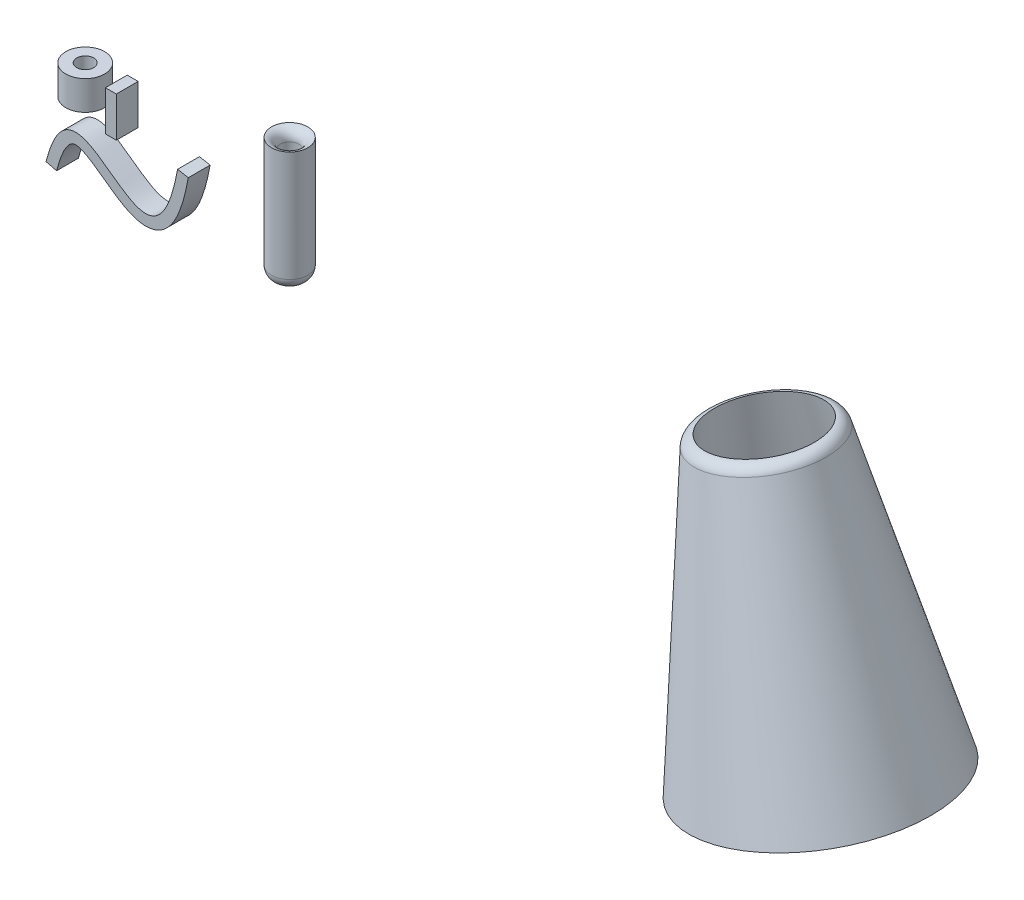
ISO-10303-21;
HEADER;
FILE_DESCRIPTION(('STEP AP214'),'2;1');
FILE_NAME('part.step','',(''),(''),'','','');
FILE_SCHEMA(('AUTOMOTIVE_DESIGN { 1 0 10303 214 1 1 1 1 }'));
ENDSEC;
DATA;
#1=APPLICATION_CONTEXT('core data for automotive mechanical design processes');
#2=APPLICATION_PROTOCOL_DEFINITION('international standard','automotive_design',2000,#1);
#3=PRODUCT_CONTEXT('',#1,'mechanical');
#4=PRODUCT('Part','Part','',(#3));
#5=PRODUCT_RELATED_PRODUCT_CATEGORY('part','',(#4));
#6=PRODUCT_DEFINITION_FORMATION('','',#4);
#7=PRODUCT_DEFINITION_CONTEXT('part definition',#1,'design');
#8=PRODUCT_DEFINITION('design','',#6,#7);
#9=PRODUCT_DEFINITION_SHAPE('','',#8);
#10=(LENGTH_UNIT() NAMED_UNIT(*) SI_UNIT(.MILLI.,.METRE.));
#11=(NAMED_UNIT(*) PLANE_ANGLE_UNIT() SI_UNIT($,.RADIAN.));
#12=(NAMED_UNIT(*) SI_UNIT($,.STERADIAN.) SOLID_ANGLE_UNIT());
#13=UNCERTAINTY_MEASURE_WITH_UNIT(LENGTH_MEASURE(1.E-05),#10,'distance_accuracy_value','');
#14=(GEOMETRIC_REPRESENTATION_CONTEXT(3) GLOBAL_UNCERTAINTY_ASSIGNED_CONTEXT((#13)) GLOBAL_UNIT_ASSIGNED_CONTEXT((#10,
#11,#12)) REPRESENTATION_CONTEXT('',''));
#15=CARTESIAN_POINT('',(0.,0.,0.));
#16=DIRECTION('',(0.,0.,1.));
#17=DIRECTION('',(1.,0.,0.));
#18=AXIS2_PLACEMENT_3D('',#15,#16,#17);
#19=CARTESIAN_POINT('',(638.372372972977,101.336227051081,0.));
#20=DIRECTION('',(0.198782437077878,-0.980043643267676,0.));
#21=DIRECTION('',(0.980043643267676,0.198782437077878,0.));
#22=AXIS2_PLACEMENT_3D('',#19,#20,#21);
#23=CONICAL_SURFACE('',#22,54.543291757021,0.184207659163879);
#24=CARTESIAN_POINT('',(640.287083984222,91.8962564840138,0.));
#25=DIRECTION('',(0.198782437077878,-0.980043643267676,0.));
#26=DIRECTION('',(0.980043643267676,0.198782437077878,0.));
#27=AXIS2_PLACEMENT_3D('',#24,#25,#26);
#28=CIRCLE('',#27,56.3379609288582);
#29=CARTESIAN_POINT('',(695.500744467212,103.095253657451,0.));
#30=VERTEX_POINT('',#29);
#31=EDGE_CURVE('E89',#30,#30,#28,.T.);
#32=ORIENTED_EDGE('',*,*,#31,.T.);
#33=EDGE_LOOP('',(#32));
#34=FACE_BOUND('',#33,.T.);
#35=CARTESIAN_POINT('',(690.219048969403,-154.279942977813,0.));
#36=DIRECTION('',(-0.198782437077878,0.980043643267676,0.));
#37=DIRECTION('',(-0.980043643267676,-0.198782437077878,0.));
#38=AXIS2_PLACEMENT_3D('',#35,#36,#37);
#39=CIRCLE('',#38,103.139466598326);
#40=CARTESIAN_POINT('',(589.137870359695,-174.782257507141,0.));
#41=VERTEX_POINT('',#40);
#42=EDGE_CURVE('E94',#41,#41,#39,.T.);
#43=ORIENTED_EDGE('',*,*,#42,.T.);
#44=EDGE_LOOP('',(#43));
#45=FACE_BOUND('',#44,.T.);
#46=ADVANCED_FACE('F78',(#34,#45),#23,.T.);
#47=CARTESIAN_POINT('',(638.663657076352,99.9001286809533,0.));
#48=DIRECTION('',(0.198782437077878,-0.980043643267676,0.));
#49=DIRECTION('',(0.980043643267676,0.198782437077878,0.));
#50=AXIS2_PLACEMENT_3D('',#47,#48,#49);
#51=CONICAL_SURFACE('',#50,46.6786382336649,0.184207659163879);
#52=CARTESIAN_POINT('',(688.595622061533,-146.276070780872,0.));
#53=DIRECTION('',(-0.198782437077878,0.980043643267676,0.));
#54=DIRECTION('',(-0.980043643267676,-0.198782437077878,0.));
#55=AXIS2_PLACEMENT_3D('',#52,#53,#54);
#56=CIRCLE('',#55,93.4801439031325);
#57=CARTESIAN_POINT('',(596.98100125752,-164.858281604327,0.));
#58=VERTEX_POINT('',#57);
#59=EDGE_CURVE('E12',#58,#58,#56,.F.);
#60=ORIENTED_EDGE('',*,*,#59,.T.);
#61=EDGE_LOOP('',(#60));
#62=FACE_BOUND('',#61,.T.);
#63=CARTESIAN_POINT('',(638.663657076352,99.9001286809533,0.));
#64=DIRECTION('',(-0.198782437077878,0.980043643267676,0.));
#65=DIRECTION('',(-0.980043643267676,-0.198782437077878,0.));
#66=AXIS2_PLACEMENT_3D('',#63,#64,#65);
#67=CIRCLE('',#66,46.6786382336648);
#68=CARTESIAN_POINT('',(592.916554399057,90.6212352133888,0.));
#69=VERTEX_POINT('',#68);
#70=EDGE_CURVE('E91',#69,#69,#67,.T.);
#71=ORIENTED_EDGE('',*,*,#70,.T.);
#72=EDGE_LOOP('',(#71));
#73=FACE_BOUND('',#72,.T.);
#74=ADVANCED_FACE('F107',(#62,#73),#51,.F.);
#75=CARTESIAN_POINT('',(640.65118911344,90.1011335213545,0.));
#76=DIRECTION('',(-0.198782437077878,0.980043643267676,0.));
#77=DIRECTION('',(-0.980043643267676,-0.198782437077878,0.));
#78=AXIS2_PLACEMENT_3D('',#75,#76,#77);
#79=TOROIDAL_SURFACE('',#78,46.507144024663,10.);
#80=ORIENTED_EDGE('',*,*,#31,.F.);
#81=EDGE_LOOP('',(#80));
#82=FACE_BOUND('',#81,.T.);
#83=ORIENTED_EDGE('',*,*,#70,.F.);
#84=EDGE_LOOP('',(#83));
#85=FACE_BOUND('',#84,.T.);
#86=ADVANCED_FACE('F101',(#82,#85),#79,.T.);
#87=CARTESIAN_POINT('',(688.231516932315,-144.480947818213,0.));
#88=DIRECTION('',(0.198782437077878,-0.980043643267676,0.));
#89=DIRECTION('',(0.980043643267676,0.198782437077878,0.));
#90=AXIS2_PLACEMENT_3D('',#87,#88,#89);
#91=TOROIDAL_SURFACE('',#90,103.310960807328,10.);
#92=ORIENTED_EDGE('',*,*,#59,.F.);
#93=EDGE_LOOP('',(#92));
#94=FACE_BOUND('',#93,.T.);
#95=ORIENTED_EDGE('',*,*,#42,.F.);
#96=EDGE_LOOP('',(#95));
#97=FACE_BOUND('',#96,.T.);
#98=ADVANCED_FACE('F85',(#94,#97),#91,.T.);
#99=CLOSED_SHELL('',(#46,#74,#86,#98));
#100=MANIFOLD_SOLID_BREP('B2',#99);
#101=CARTESIAN_POINT('',(203.452118624857,111.046344000849,0.));
#102=DIRECTION('',(0.,1.,0.));
#103=DIRECTION('',(0.,0.,1.));
#104=AXIS2_PLACEMENT_3D('',#101,#102,#103);
#105=CYLINDRICAL_SURFACE('',#104,16.6116934547917);
#106=CARTESIAN_POINT('',(203.452118624857,9.79795897113271,0.));
#107=DIRECTION('',(0.,-1.,0.));
#108=DIRECTION('',(0.,0.,-1.));
#109=AXIS2_PLACEMENT_3D('',#106,#107,#108);
#110=CIRCLE('',#109,16.6116934547917);
#111=CARTESIAN_POINT('',(203.452118624857,9.79795897113271,-16.6116934547917));
#112=VERTEX_POINT('',#111);
#113=EDGE_CURVE('E79',#112,#112,#110,.F.);
#114=ORIENTED_EDGE('',*,*,#113,.T.);
#115=EDGE_LOOP('',(#114));
#116=FACE_BOUND('',#115,.T.);
#117=CARTESIAN_POINT('',(203.452118624857,111.046344000849,0.));
#118=DIRECTION('',(0.,1.,0.));
#119=DIRECTION('',(0.,0.,1.));
#120=AXIS2_PLACEMENT_3D('',#117,#118,#119);
#121=CIRCLE('',#120,16.6116934547917);
#122=CARTESIAN_POINT('',(203.452118624857,111.046344000849,16.6116934547917));
#123=VERTEX_POINT('',#122);
#124=EDGE_CURVE('E164',#123,#123,#121,.T.);
#125=ORIENTED_EDGE('',*,*,#124,.F.);
#126=EDGE_LOOP('',(#125));
#127=FACE_BOUND('',#126,.T.);
#128=ADVANCED_FACE('F148',(#116,#127),#105,.T.);
#129=CARTESIAN_POINT('',(203.452118624857,111.046344000849,0.));
#130=DIRECTION('',(0.,1.,0.));
#131=DIRECTION('',(0.,0.,1.));
#132=AXIS2_PLACEMENT_3D('',#129,#130,#131);
#133=CYLINDRICAL_SURFACE('',#132,8.61169345479168);
#134=CARTESIAN_POINT('',(203.452118624857,101.248385029717,0.));
#135=DIRECTION('',(0.,1.,0.));
#136=DIRECTION('',(0.,0.,1.));
#137=AXIS2_PLACEMENT_3D('',#134,#135,#136);
#138=CIRCLE('',#137,8.61169345479168);
#139=CARTESIAN_POINT('',(203.452118624857,101.248385029717,8.61169345479168));
#140=VERTEX_POINT('',#139);
#141=EDGE_CURVE('E160',#140,#140,#138,.T.);
#142=ORIENTED_EDGE('',*,*,#141,.T.);
#143=EDGE_LOOP('',(#142));
#144=FACE_BOUND('',#143,.T.);
#145=CARTESIAN_POINT('',(203.452118624857,0.,0.));
#146=DIRECTION('',(0.,1.,0.));
#147=DIRECTION('',(0.,0.,1.));
#148=AXIS2_PLACEMENT_3D('',#145,#146,#147);
#149=CIRCLE('',#148,8.61169345479168);
#150=CARTESIAN_POINT('',(203.452118624857,0.,8.61169345479168));
#151=VERTEX_POINT('',#150);
#152=EDGE_CURVE('E163',#151,#151,#149,.T.);
#153=ORIENTED_EDGE('',*,*,#152,.F.);
#154=EDGE_LOOP('',(#153));
#155=FACE_BOUND('',#154,.T.);
#156=ADVANCED_FACE('F174',(#144,#155),#133,.F.);
#157=CARTESIAN_POINT('',(203.452118624857,101.248385029717,0.));
#158=DIRECTION('',(0.,1.,0.));
#159=DIRECTION('',(0.,0.,1.));
#160=AXIS2_PLACEMENT_3D('',#157,#158,#159);
#161=TOROIDAL_SURFACE('',#160,18.6116934547917,10.);
#162=ORIENTED_EDGE('',*,*,#124,.T.);
#163=EDGE_LOOP('',(#162));
#164=FACE_BOUND('',#163,.T.);
#165=ORIENTED_EDGE('',*,*,#141,.F.);
#166=EDGE_LOOP('',(#165));
#167=FACE_BOUND('',#166,.T.);
#168=ADVANCED_FACE('F171',(#164,#167),#161,.T.);
#169=CARTESIAN_POINT('',(203.452118624857,9.79795897113271,0.));
#170=DIRECTION('',(0.,-1.,0.));
#171=DIRECTION('',(0.,0.,-1.));
#172=AXIS2_PLACEMENT_3D('',#169,#170,#171);
#173=DEGENERATE_TOROIDAL_SURFACE('',#172,6.61169345479169,10.,.T.);
#174=ORIENTED_EDGE('',*,*,#152,.T.);
#175=EDGE_LOOP('',(#174));
#176=FACE_BOUND('',#175,.T.);
#177=ORIENTED_EDGE('',*,*,#113,.F.);
#178=EDGE_LOOP('',(#177));
#179=FACE_BOUND('',#178,.T.);
#180=ADVANCED_FACE('F154',(#176,#179),#173,.T.);
#181=CLOSED_SHELL('',(#128,#156,#168,#180));
#182=MANIFOLD_SOLID_BREP('B7',#181);
#183=CARTESIAN_POINT('',(15.9614921578128,76.4416820248492,0.));
#184=DIRECTION('',(0.,1.,0.));
#185=DIRECTION('',(0.,0.,1.));
#186=AXIS2_PLACEMENT_3D('',#183,#184,#185);
#187=CYLINDRICAL_SURFACE('',#186,17.7908818906369);
#188=CARTESIAN_POINT('',(15.9614921578128,49.6230693628492,0.));
#189=DIRECTION('',(0.,1.,0.));
#190=DIRECTION('',(0.,0.,1.));
#191=AXIS2_PLACEMENT_3D('',#188,#189,#190);
#192=CIRCLE('',#191,17.7908818906369);
#193=CARTESIAN_POINT('',(15.9614921578128,49.6230693628492,17.7908818906369));
#194=VERTEX_POINT('',#193);
#195=EDGE_CURVE('E146',#194,#194,#192,.T.);
#196=ORIENTED_EDGE('',*,*,#195,.T.);
#197=EDGE_LOOP('',(#196));
#198=FACE_BOUND('',#197,.T.);
#199=CARTESIAN_POINT('',(15.9614921578128,76.4416820248492,0.));
#200=DIRECTION('',(0.,1.,0.));
#201=DIRECTION('',(0.,0.,1.));
#202=AXIS2_PLACEMENT_3D('',#199,#200,#201);
#203=CIRCLE('',#202,17.7908818906369);
#204=CARTESIAN_POINT('',(15.9614921578128,76.4416820248492,17.7908818906369));
#205=VERTEX_POINT('',#204);
#206=EDGE_CURVE('E236',#205,#205,#203,.T.);
#207=ORIENTED_EDGE('',*,*,#206,.F.);
#208=EDGE_LOOP('',(#207));
#209=FACE_BOUND('',#208,.T.);
#210=ADVANCED_FACE('F225',(#198,#209),#187,.T.);
#211=CARTESIAN_POINT('',(8.17061026717587,49.6230693628492,0.));
#212=DIRECTION('',(0.,1.,0.));
#213=DIRECTION('',(0.,0.,1.));
#214=AXIS2_PLACEMENT_3D('',#211,#212,#213);
#215=PLANE('',#214);
#216=ORIENTED_EDGE('',*,*,#195,.F.);
#217=EDGE_LOOP('',(#216));
#218=FACE_BOUND('',#217,.T.);
#219=CARTESIAN_POINT('',(15.9614921578128,49.6230693628492,0.));
#220=DIRECTION('',(0.,1.,0.));
#221=DIRECTION('',(0.,0.,1.));
#222=AXIS2_PLACEMENT_3D('',#219,#220,#221);
#223=CIRCLE('',#222,7.79088189063688);
#224=CARTESIAN_POINT('',(15.9614921578128,49.6230693628492,7.79088189063688));
#225=VERTEX_POINT('',#224);
#226=EDGE_CURVE('E226',#225,#225,#223,.T.);
#227=ORIENTED_EDGE('',*,*,#226,.T.);
#228=EDGE_LOOP('',(#227));
#229=FACE_BOUND('',#228,.T.);
#230=ADVANCED_FACE('F244',(#218,#229),#215,.F.);
#231=CARTESIAN_POINT('',(15.9614921578128,76.4416820248492,0.));
#232=DIRECTION('',(0.,1.,0.));
#233=DIRECTION('',(0.,0.,1.));
#234=AXIS2_PLACEMENT_3D('',#231,#232,#233);
#235=CYLINDRICAL_SURFACE('',#234,7.79088189063688);
#236=ORIENTED_EDGE('',*,*,#226,.F.);
#237=EDGE_LOOP('',(#236));
#238=FACE_BOUND('',#237,.T.);
#239=CARTESIAN_POINT('',(15.9614921578128,76.4416820248492,0.));
#240=DIRECTION('',(0.,1.,0.));
#241=DIRECTION('',(0.,0.,1.));
#242=AXIS2_PLACEMENT_3D('',#239,#240,#241);
#243=CIRCLE('',#242,7.79088189063688);
#244=CARTESIAN_POINT('',(15.9614921578128,76.4416820248492,7.79088189063688));
#245=VERTEX_POINT('',#244);
#246=EDGE_CURVE('E235',#245,#245,#243,.T.);
#247=ORIENTED_EDGE('',*,*,#246,.T.);
#248=EDGE_LOOP('',(#247));
#249=FACE_BOUND('',#248,.T.);
#250=ADVANCED_FACE('F248',(#238,#249),#235,.F.);
#251=CARTESIAN_POINT('',(-1.82938973282413,76.4416820248492,0.));
#252=DIRECTION('',(0.,-1.,0.));
#253=DIRECTION('',(0.,0.,-1.));
#254=AXIS2_PLACEMENT_3D('',#251,#252,#253);
#255=PLANE('',#254);
#256=ORIENTED_EDGE('',*,*,#246,.F.);
#257=EDGE_LOOP('',(#256));
#258=FACE_BOUND('',#257,.T.);
#259=ORIENTED_EDGE('',*,*,#206,.T.);
#260=EDGE_LOOP('',(#259));
#261=FACE_BOUND('',#260,.T.);
#262=ADVANCED_FACE('F245',(#258,#261),#255,.F.);
#263=CLOSED_SHELL('',(#210,#230,#250,#262));
#264=MANIFOLD_SOLID_BREP('B72',#263);
#265=CARTESIAN_POINT('',(54.4899386332439,85.934780446792,20.));
#266=DIRECTION('',(1.,0.,0.));
#267=DIRECTION('',(0.,0.,-1.));
#268=AXIS2_PLACEMENT_3D('',#265,#266,#267);
#269=PLANE('',#268);
#270=DIRECTION('',(0.,1.,0.));
#271=VECTOR('',#270,1.);
#272=CARTESIAN_POINT('',(54.4899386332439,85.934780446792,0.));
#273=LINE('',#272,#271);
#274=CARTESIAN_POINT('',(54.4899386332439,85.934780446792,0.));
#275=VERTEX_POINT('',#274);
#276=CARTESIAN_POINT('',(54.4899386332439,49.2246455853272,0.));
#277=VERTEX_POINT('',#276);
#278=EDGE_CURVE('E358',#275,#277,#273,.F.);
#279=ORIENTED_EDGE('',*,*,#278,.T.);
#280=DIRECTION('',(0.,0.,-1.));
#281=VECTOR('',#280,1.);
#282=CARTESIAN_POINT('',(54.4899386332439,49.2246455853272,20.));
#283=LINE('',#282,#281);
#284=CARTESIAN_POINT('',(54.4899386332439,49.2246455853272,20.));
#285=VERTEX_POINT('',#284);
#286=EDGE_CURVE('E218',#285,#277,#283,.T.);
#287=ORIENTED_EDGE('',*,*,#286,.F.);
#288=DIRECTION('',(0.,1.,0.));
#289=VECTOR('',#288,1.);
#290=CARTESIAN_POINT('',(54.4899386332439,85.934780446792,20.));
#291=LINE('',#290,#289);
#292=CARTESIAN_POINT('',(54.4899386332439,85.934780446792,20.));
#293=VERTEX_POINT('',#292);
#294=EDGE_CURVE('E333',#293,#285,#291,.F.);
#295=ORIENTED_EDGE('',*,*,#294,.F.);
#296=DIRECTION('',(0.,0.,-1.));
#297=VECTOR('',#296,1.);
#298=CARTESIAN_POINT('',(54.4899386332439,85.934780446792,20.));
#299=LINE('',#298,#297);
#300=EDGE_CURVE('E307',#293,#275,#299,.T.);
#301=ORIENTED_EDGE('',*,*,#300,.T.);
#302=EDGE_LOOP('',(#279,#287,#295,#301));
#303=FACE_BOUND('',#302,.T.);
#304=ADVANCED_FACE('F291',(#303),#269,.F.);
#305=CARTESIAN_POINT('',(64.4899386332439,49.2246455853272,20.));
#306=DIRECTION('',(0.,-1.,0.));
#307=DIRECTION('',(0.,0.,-1.));
#308=AXIS2_PLACEMENT_3D('',#305,#306,#307);
#309=PLANE('',#308);
#310=DIRECTION('',(-1.,0.,0.));
#311=VECTOR('',#310,1.);
#312=CARTESIAN_POINT('',(64.4899386332439,49.2246455853272,0.));
#313=LINE('',#312,#311);
#314=CARTESIAN_POINT('',(64.4899386332439,49.2246455853272,0.));
#315=VERTEX_POINT('',#314);
#316=EDGE_CURVE('E345',#315,#277,#313,.T.);
#317=ORIENTED_EDGE('',*,*,#316,.F.);
#318=DIRECTION('',(0.,0.,-1.));
#319=VECTOR('',#318,1.);
#320=CARTESIAN_POINT('',(64.4899386332439,49.2246455853272,20.));
#321=LINE('',#320,#319);
#322=CARTESIAN_POINT('',(64.4899386332439,49.2246455853272,20.));
#323=VERTEX_POINT('',#322);
#324=EDGE_CURVE('E301',#323,#315,#321,.T.);
#325=ORIENTED_EDGE('',*,*,#324,.F.);
#326=DIRECTION('',(-1.,0.,0.));
#327=VECTOR('',#326,1.);
#328=CARTESIAN_POINT('',(64.4899386332439,49.2246455853272,20.));
#329=LINE('',#328,#327);
#330=EDGE_CURVE('E338',#323,#285,#329,.T.);
#331=ORIENTED_EDGE('',*,*,#330,.T.);
#332=ORIENTED_EDGE('',*,*,#286,.T.);
#333=EDGE_LOOP('',(#317,#325,#331,#332));
#334=FACE_BOUND('',#333,.T.);
#335=ADVANCED_FACE('F339',(#334),#309,.T.);
#336=CARTESIAN_POINT('',(64.4899386332439,85.934780446792,20.));
#337=DIRECTION('',(1.,0.,0.));
#338=DIRECTION('',(0.,0.,-1.));
#339=AXIS2_PLACEMENT_3D('',#336,#337,#338);
#340=PLANE('',#339);
#341=DIRECTION('',(0.,-1.,0.));
#342=VECTOR('',#341,1.);
#343=CARTESIAN_POINT('',(64.4899386332439,85.934780446792,0.));
#344=LINE('',#343,#342);
#345=CARTESIAN_POINT('',(64.4899386332439,85.934780446792,0.));
#346=VERTEX_POINT('',#345);
#347=EDGE_CURVE('E360',#346,#315,#344,.T.);
#348=ORIENTED_EDGE('',*,*,#347,.F.);
#349=DIRECTION('',(0.,0.,-1.));
#350=VECTOR('',#349,1.);
#351=CARTESIAN_POINT('',(64.4899386332439,85.934780446792,20.));
#352=LINE('',#351,#350);
#353=CARTESIAN_POINT('',(64.4899386332439,85.934780446792,20.));
#354=VERTEX_POINT('',#353);
#355=EDGE_CURVE('E325',#354,#346,#352,.T.);
#356=ORIENTED_EDGE('',*,*,#355,.F.);
#357=DIRECTION('',(0.,-1.,0.));
#358=VECTOR('',#357,1.);
#359=CARTESIAN_POINT('',(64.4899386332439,85.934780446792,20.));
#360=LINE('',#359,#358);
#361=EDGE_CURVE('E350',#354,#323,#360,.T.);
#362=ORIENTED_EDGE('',*,*,#361,.T.);
#363=ORIENTED_EDGE('',*,*,#324,.T.);
#364=EDGE_LOOP('',(#348,#356,#362,#363));
#365=FACE_BOUND('',#364,.T.);
#366=ADVANCED_FACE('F348',(#365),#340,.T.);
#367=CARTESIAN_POINT('',(54.4899386332439,85.934780446792,20.));
#368=DIRECTION('',(0.,1.,0.));
#369=DIRECTION('',(0.,0.,1.));
#370=AXIS2_PLACEMENT_3D('',#367,#368,#369);
#371=PLANE('',#370);
#372=DIRECTION('',(1.,0.,0.));
#373=VECTOR('',#372,1.);
#374=CARTESIAN_POINT('',(54.4899386332439,85.934780446792,0.));
#375=LINE('',#374,#373);
#376=EDGE_CURVE('E363',#275,#346,#375,.T.);
#377=ORIENTED_EDGE('',*,*,#376,.F.);
#378=ORIENTED_EDGE('',*,*,#300,.F.);
#379=DIRECTION('',(1.,0.,0.));
#380=VECTOR('',#379,1.);
#381=CARTESIAN_POINT('',(54.4899386332439,85.934780446792,20.));
#382=LINE('',#381,#380);
#383=EDGE_CURVE('E351',#293,#354,#382,.T.);
#384=ORIENTED_EDGE('',*,*,#383,.T.);
#385=ORIENTED_EDGE('',*,*,#355,.T.);
#386=EDGE_LOOP('',(#377,#378,#384,#385));
#387=FACE_BOUND('',#386,.T.);
#388=ADVANCED_FACE('F370',(#387),#371,.T.);
#389=CARTESIAN_POINT('',(0.,0.,20.));
#390=DIRECTION('',(0.,0.,1.));
#391=DIRECTION('',(1.,0.,0.));
#392=AXIS2_PLACEMENT_3D('',#389,#390,#391);
#393=PLANE('',#392);
#394=ORIENTED_EDGE('',*,*,#294,.T.);
#395=ORIENTED_EDGE('',*,*,#330,.F.);
#396=ORIENTED_EDGE('',*,*,#361,.F.);
#397=ORIENTED_EDGE('',*,*,#383,.F.);
#398=EDGE_LOOP('',(#394,#395,#396,#397));
#399=FACE_BOUND('',#398,.T.);
#400=ADVANCED_FACE('F349',(#399),#393,.T.);
#401=CARTESIAN_POINT('',(0.,0.,0.));
#402=DIRECTION('',(0.,0.,1.));
#403=DIRECTION('',(1.,0.,0.));
#404=AXIS2_PLACEMENT_3D('',#401,#402,#403);
#405=PLANE('',#404);
#406=ORIENTED_EDGE('',*,*,#278,.F.);
#407=ORIENTED_EDGE('',*,*,#376,.T.);
#408=ORIENTED_EDGE('',*,*,#347,.T.);
#409=ORIENTED_EDGE('',*,*,#316,.T.);
#410=EDGE_LOOP('',(#406,#407,#408,#409));
#411=FACE_BOUND('',#410,.T.);
#412=ADVANCED_FACE('F366',(#411),#405,.F.);
#413=CLOSED_SHELL('',(#304,#335,#366,#388,#400,#412));
#414=MANIFOLD_SOLID_BREP('B144',#413);
#415=CARTESIAN_POINT('',(9.69490923590925,-2.4512720998456,20.));
#416=CARTESIAN_POINT('',(10.5311688474778,0.856178359172851,20.));
#417=CARTESIAN_POINT('',(11.394386774256,3.84419741254524,20.));
#418=CARTESIAN_POINT('',(13.1533592305206,9.20694051284605,20.));
#419=CARTESIAN_POINT('',(14.0492896362296,11.5815145840632,20.));
#420=CARTESIAN_POINT('',(15.8413121087331,15.742658734528,20.));
#421=CARTESIAN_POINT('',(16.737517517862,17.5287647227855,20.));
#422=CARTESIAN_POINT('',(18.4814345025707,20.5463967391919,20.));
#423=CARTESIAN_POINT('',(19.3286793802721,21.7769702062188,20.));
#424=CARTESIAN_POINT('',(20.9123918030556,23.7460025130972,20.));
#425=CARTESIAN_POINT('',(21.6468668792936,24.4838050755776,20.));
#426=CARTESIAN_POINT('',(22.9626621572418,25.5880403665081,20.));
#427=CARTESIAN_POINT('',(23.5417164826069,25.9567946857274,20.));
#428=CARTESIAN_POINT('',(24.5982667995349,26.4876499635343,20.));
#429=CARTESIAN_POINT('',(25.0784708138462,26.6536744426382,20.));
#430=CARTESIAN_POINT('',(26.0947773614352,26.8786677388824,20.));
#431=CARTESIAN_POINT('',(26.6354672734258,26.9362581428574,20.));
#432=CARTESIAN_POINT('',(27.9016220528546,26.9202105728274,20.));
#433=CARTESIAN_POINT('',(28.6267698076733,26.8433228296364,20.));
#434=CARTESIAN_POINT('',(30.2827198681421,26.501626749094,20.));
#435=CARTESIAN_POINT('',(31.2115323200941,26.2360905599305,20.));
#436=CARTESIAN_POINT('',(33.2381790124912,25.4970253861064,20.));
#437=CARTESIAN_POINT('',(34.3350401710325,25.0239655597566,20.));
#438=CARTESIAN_POINT('',(36.6545545212303,23.8839035231942,20.));
#439=CARTESIAN_POINT('',(37.8770010886368,23.2173466425486,20.));
#440=CARTESIAN_POINT('',(40.413779447504,21.7212794308362,20.));
#441=CARTESIAN_POINT('',(41.7281493534382,20.8920027901708,20.));
#442=CARTESIAN_POINT('',(44.4249998964398,19.1079431631433,20.));
#443=CARTESIAN_POINT('',(45.8075500630837,18.1532614063299,20.));
#444=CARTESIAN_POINT('',(50.0335414120897,15.1597754687626,20.));
#445=CARTESIAN_POINT('',(52.9529117796699,12.9920070265115,20.));
#446=CARTESIAN_POINT('',(58.9368445543254,8.62200824840444,20.));
#447=CARTESIAN_POINT('',(62.0007966750851,6.41938014676282,20.));
#448=CARTESIAN_POINT('',(66.7257978693274,3.31532694879324,20.));
#449=CARTESIAN_POINT('',(68.3230359680193,2.313869999449,20.));
#450=CARTESIAN_POINT('',(71.5770117142215,0.417572758509964,20.));
#451=CARTESIAN_POINT('',(73.2337136485033,-0.477527792876216,20.));
#452=CARTESIAN_POINT('',(76.6317569670157,-2.11375987107278,20.));
#453=CARTESIAN_POINT('',(78.3733528188264,-2.85538269335876,20.));
#454=CARTESIAN_POINT('',(81.9745983323873,-4.11884560626711,20.));
#455=CARTESIAN_POINT('',(83.8353857946341,-4.64115314789327,20.));
#456=CARTESIAN_POINT('',(87.6984061214208,-5.36551199552065,20.));
#457=CARTESIAN_POINT('',(89.7028005800273,-5.56654784071354,20.));
#458=CARTESIAN_POINT('',(92.7872249227571,-5.52733551388739,20.));
#459=CARTESIAN_POINT('',(93.8275778829024,-5.45729724278707,20.));
#460=CARTESIAN_POINT('',(95.9174101948477,-5.18908376162479,20.));
#461=CARTESIAN_POINT('',(96.9667901072056,-4.99079603224231,20.));
#462=CARTESIAN_POINT('',(99.0536589714669,-4.45778102161726,20.));
#463=CARTESIAN_POINT('',(100.0909704087,-4.12302677221439,20.));
#464=CARTESIAN_POINT('',(102.131284140322,-3.3172969507252,20.));
#465=CARTESIAN_POINT('',(103.13412254263,-2.84641134529941,20.));
#466=CARTESIAN_POINT('',(106.063715631323,-1.24117058796995,20.));
#467=CARTESIAN_POINT('',(107.907320493612,0.0849084234402593,20.));
#468=CARTESIAN_POINT('',(111.324584701444,3.16057354469398,20.));
#469=CARTESIAN_POINT('',(112.900958390548,4.90829500464283,20.));
#470=CARTESIAN_POINT('',(115.827345406093,8.7851531963294,20.));
#471=CARTESIAN_POINT('',(117.179193265889,10.9152075498616,20.));
#472=CARTESIAN_POINT('',(119.713037579898,15.5776997205682,20.));
#473=CARTESIAN_POINT('',(120.895351993834,18.1110774147558,20.));
#474=CARTESIAN_POINT('',(123.128090663281,23.6279089006282,20.));
#475=CARTESIAN_POINT('',(124.178355260339,26.6117757902841,20.));
#476=CARTESIAN_POINT('',(127.162248988825,36.3184054964138,20.));
#477=CARTESIAN_POINT('',(128.931571554216,43.7980034470408,20.));
#478=CARTESIAN_POINT('',(130.507605162531,52.487115477251,20.));
#479=B_SPLINE_CURVE_WITH_KNOTS('',3,(#415,#416,#417,#418,#419,#420,#421,#422,#423,#424,#425,
#426,#427,#428,#429,#430,#431,#432,#433,#434,#435,#436,#437,#438,#439,#440,#441,#442,#443,#444,
#445,#446,#447,#448,#449,#450,#451,#452,#453,#454,#455,#456,#457,#458,#459,#460,#461,#462,#463,
#464,#465,#466,#467,#468,#469,#470,#471,#472,#473,#474,#475,#476,#477,#478),.UNSPECIFIED.,.F.,
.F.,(4,2,2,2,2,2,2,2,2,2,2,2,2,2,2,2,2,2,2,2,2,2,2,2,2,2,2,2,2,2,2,4),(0.,0.03125,
0.0624999999999999,0.0937499999999999,0.125,0.15625,0.1875,0.21875,0.25,0.28125,0.3125,0.34375,
0.375,0.40625,0.4375,0.5,0.5625,0.59375,0.625,0.65625,0.6875,0.71875,0.734375,0.75,0.765625,
0.78125,0.8125,0.84375,0.875,0.90625,0.9375,1.),.UNSPECIFIED.);
#480=DIRECTION('',(0.,0.,-1.));
#481=VECTOR('',#480,1.);
#482=SURFACE_OF_LINEAR_EXTRUSION('',#479,#481);
#483=CARTESIAN_POINT('',(9.69490923590925,-2.4512720998456,0.));
#484=CARTESIAN_POINT('',(10.5311688474778,0.856178359172851,0.));
#485=CARTESIAN_POINT('',(11.394386774256,3.84419741254524,0.));
#486=CARTESIAN_POINT('',(13.1533592305206,9.20694051284605,0.));
#487=CARTESIAN_POINT('',(14.0492896362296,11.5815145840632,0.));
#488=CARTESIAN_POINT('',(15.8413121087331,15.742658734528,0.));
#489=CARTESIAN_POINT('',(16.737517517862,17.5287647227855,0.));
#490=CARTESIAN_POINT('',(18.4814345025707,20.5463967391919,0.));
#491=CARTESIAN_POINT('',(19.3286793802721,21.7769702062188,0.));
#492=CARTESIAN_POINT('',(20.9123918030556,23.7460025130972,0.));
#493=CARTESIAN_POINT('',(21.6468668792936,24.4838050755776,0.));
#494=CARTESIAN_POINT('',(22.9626621572418,25.5880403665081,0.));
#495=CARTESIAN_POINT('',(23.5417164826069,25.9567946857274,0.));
#496=CARTESIAN_POINT('',(24.5982667995349,26.4876499635343,0.));
#497=CARTESIAN_POINT('',(25.0784708138462,26.6536744426382,0.));
#498=CARTESIAN_POINT('',(26.0947773614352,26.8786677388824,0.));
#499=CARTESIAN_POINT('',(26.6354672734258,26.9362581428574,0.));
#500=CARTESIAN_POINT('',(27.9016220528546,26.9202105728274,0.));
#501=CARTESIAN_POINT('',(28.6267698076733,26.8433228296364,0.));
#502=CARTESIAN_POINT('',(30.2827198681421,26.501626749094,0.));
#503=CARTESIAN_POINT('',(31.2115323200941,26.2360905599305,0.));
#504=CARTESIAN_POINT('',(33.2381790124912,25.4970253861064,0.));
#505=CARTESIAN_POINT('',(34.3350401710325,25.0239655597566,0.));
#506=CARTESIAN_POINT('',(36.6545545212303,23.8839035231942,0.));
#507=CARTESIAN_POINT('',(37.8770010886368,23.2173466425486,0.));
#508=CARTESIAN_POINT('',(40.413779447504,21.7212794308362,0.));
#509=CARTESIAN_POINT('',(41.7281493534382,20.8920027901708,0.));
#510=CARTESIAN_POINT('',(44.4249998964398,19.1079431631433,0.));
#511=CARTESIAN_POINT('',(45.8075500630837,18.1532614063299,0.));
#512=CARTESIAN_POINT('',(50.0335414120897,15.1597754687626,0.));
#513=CARTESIAN_POINT('',(52.9529117796699,12.9920070265115,0.));
#514=CARTESIAN_POINT('',(58.9368445543254,8.62200824840444,0.));
#515=CARTESIAN_POINT('',(62.0007966750851,6.41938014676282,0.));
#516=CARTESIAN_POINT('',(66.7257978693274,3.31532694879324,0.));
#517=CARTESIAN_POINT('',(68.3230359680193,2.313869999449,0.));
#518=CARTESIAN_POINT('',(71.5770117142215,0.417572758509964,0.));
#519=CARTESIAN_POINT('',(73.2337136485033,-0.477527792876216,0.));
#520=CARTESIAN_POINT('',(76.6317569670157,-2.11375987107278,0.));
#521=CARTESIAN_POINT('',(78.3733528188264,-2.85538269335876,0.));
#522=CARTESIAN_POINT('',(81.9745983323873,-4.11884560626711,0.));
#523=CARTESIAN_POINT('',(83.8353857946341,-4.64115314789327,0.));
#524=CARTESIAN_POINT('',(87.6984061214208,-5.36551199552065,0.));
#525=CARTESIAN_POINT('',(89.7028005800273,-5.56654784071354,0.));
#526=CARTESIAN_POINT('',(92.7872249227571,-5.52733551388739,0.));
#527=CARTESIAN_POINT('',(93.8275778829024,-5.45729724278707,0.));
#528=CARTESIAN_POINT('',(95.9174101948477,-5.18908376162479,0.));
#529=CARTESIAN_POINT('',(96.9667901072056,-4.99079603224231,0.));
#530=CARTESIAN_POINT('',(99.0536589714669,-4.45778102161726,0.));
#531=CARTESIAN_POINT('',(100.0909704087,-4.12302677221439,0.));
#532=CARTESIAN_POINT('',(102.131284140322,-3.3172969507252,0.));
#533=CARTESIAN_POINT('',(103.13412254263,-2.84641134529941,0.));
#534=CARTESIAN_POINT('',(106.063715631323,-1.24117058796995,0.));
#535=CARTESIAN_POINT('',(107.907320493612,0.0849084234402593,0.));
#536=CARTESIAN_POINT('',(111.324584701444,3.16057354469398,0.));
#537=CARTESIAN_POINT('',(112.900958390548,4.90829500464283,0.));
#538=CARTESIAN_POINT('',(115.827345406093,8.7851531963294,0.));
#539=CARTESIAN_POINT('',(117.179193265889,10.9152075498616,0.));
#540=CARTESIAN_POINT('',(119.713037579898,15.5776997205682,0.));
#541=CARTESIAN_POINT('',(120.895351993834,18.1110774147558,0.));
#542=CARTESIAN_POINT('',(123.128090663281,23.6279089006282,0.));
#543=CARTESIAN_POINT('',(124.178355260339,26.6117757902841,0.));
#544=CARTESIAN_POINT('',(127.162248988825,36.3184054964138,0.));
#545=CARTESIAN_POINT('',(128.931571554216,43.7980034470408,0.));
#546=CARTESIAN_POINT('',(130.507605162531,52.487115477251,0.));
#547=B_SPLINE_CURVE_WITH_KNOTS('',3,(#483,#484,#485,#486,#487,#488,#489,#490,#491,#492,#493,
#494,#495,#496,#497,#498,#499,#500,#501,#502,#503,#504,#505,#506,#507,#508,#509,#510,#511,#512,
#513,#514,#515,#516,#517,#518,#519,#520,#521,#522,#523,#524,#525,#526,#527,#528,#529,#530,#531,
#532,#533,#534,#535,#536,#537,#538,#539,#540,#541,#542,#543,#544,#545,#546),.UNSPECIFIED.,.F.,
.F.,(4,2,2,2,2,2,2,2,2,2,2,2,2,2,2,2,2,2,2,2,2,2,2,2,2,2,2,2,2,2,2,4),(0.,0.03125,
0.0624999999999999,0.0937499999999999,0.125,0.15625,0.1875,0.21875,0.25,0.28125,0.3125,0.34375,
0.375,0.40625,0.4375,0.5,0.5625,0.59375,0.625,0.65625,0.6875,0.71875,0.734375,0.75,0.765625,
0.78125,0.8125,0.84375,0.875,0.90625,0.9375,1.),.UNSPECIFIED.);
#548=CARTESIAN_POINT('',(9.69490923590925,-2.4512720998456,0.));
#549=VERTEX_POINT('',#548);
#550=CARTESIAN_POINT('',(130.507605162531,52.4871154772509,0.));
#551=VERTEX_POINT('',#550);
#552=EDGE_CURVE('E500',#549,#551,#547,.T.);
#553=ORIENTED_EDGE('',*,*,#552,.T.);
#554=DIRECTION('',(0.,0.,-1.));
#555=VECTOR('',#554,1.);
#556=CARTESIAN_POINT('',(130.507605162531,52.4871154772509,20.));
#557=LINE('',#556,#555);
#558=CARTESIAN_POINT('',(130.507605162531,52.4871154772509,20.));
#559=VERTEX_POINT('',#558);
#560=EDGE_CURVE('E293',#559,#551,#557,.T.);
#561=ORIENTED_EDGE('',*,*,#560,.F.);
#562=CARTESIAN_POINT('',(9.69490923590925,-2.4512720998456,20.));
#563=VERTEX_POINT('',#562);
#564=EDGE_CURVE('E460',#563,#559,#479,.T.);
#565=ORIENTED_EDGE('',*,*,#564,.F.);
#566=DIRECTION('',(0.,0.,-1.));
#567=VECTOR('',#566,1.);
#568=CARTESIAN_POINT('',(9.69490923590925,-2.4512720998456,20.));
#569=LINE('',#568,#567);
#570=EDGE_CURVE('E432',#563,#549,#569,.T.);
#571=ORIENTED_EDGE('',*,*,#570,.T.);
#572=EDGE_LOOP('',(#553,#561,#565,#571));
#573=FACE_BOUND('',#572,.T.);
#574=ADVANCED_FACE('F420',(#573),#482,.F.);
#575=CARTESIAN_POINT('',(120.668148618609,54.2717989002357,20.));
#576=DIRECTION('',(0.178468342298472,0.98394565439217,0.));
#577=DIRECTION('',(-0.98394565439217,0.178468342298472,0.));
#578=AXIS2_PLACEMENT_3D('',#575,#576,#577);
#579=PLANE('',#578);
#580=DIRECTION('',(0.98394565439217,-0.178468342298472,0.));
#581=VECTOR('',#580,1.);
#582=CARTESIAN_POINT('',(120.668148618609,54.2717989002357,0.));
#583=LINE('',#582,#581);
#584=CARTESIAN_POINT('',(120.668148618609,54.2717989002357,0.));
#585=VERTEX_POINT('',#584);
#586=EDGE_CURVE('E470',#585,#551,#583,.T.);
#587=ORIENTED_EDGE('',*,*,#586,.F.);
#588=DIRECTION('',(0.,0.,-1.));
#589=VECTOR('',#588,1.);
#590=CARTESIAN_POINT('',(120.668148618609,54.2717989002357,20.));
#591=LINE('',#590,#589);
#592=CARTESIAN_POINT('',(120.668148618609,54.2717989002357,20.));
#593=VERTEX_POINT('',#592);
#594=EDGE_CURVE('E428',#593,#585,#591,.T.);
#595=ORIENTED_EDGE('',*,*,#594,.F.);
#596=DIRECTION('',(0.98394565439217,-0.178468342298472,0.));
#597=VECTOR('',#596,1.);
#598=CARTESIAN_POINT('',(120.668148618609,54.2717989002357,20.));
#599=LINE('',#598,#597);
#600=EDGE_CURVE('E464',#593,#559,#599,.T.);
#601=ORIENTED_EDGE('',*,*,#600,.T.);
#602=ORIENTED_EDGE('',*,*,#560,.T.);
#603=EDGE_LOOP('',(#587,#595,#601,#602));
#604=FACE_BOUND('',#603,.T.);
#605=ADVANCED_FACE('F462',(#604),#579,.T.);
#606=CARTESIAN_POINT('',(0.,0.,20.));
#607=CARTESIAN_POINT('',(28.3563158244911,112.15071072711,20.));
#608=CARTESIAN_POINT('',(96.3343394540236,-79.8872652449302,20.));
#609=CARTESIAN_POINT('',(120.668148618609,54.2717989002357,20.));
#610=B_SPLINE_CURVE_WITH_KNOTS('',3,(#606,#607,#608,#609),.UNSPECIFIED.,.F.,.F.,(4,4),(0.,1.),.UNSPECIFIED.);
#611=DIRECTION('',(0.,0.,-1.));
#612=VECTOR('',#611,1.);
#613=SURFACE_OF_LINEAR_EXTRUSION('',#610,#612);
#614=CARTESIAN_POINT('',(0.,0.,0.));
#615=CARTESIAN_POINT('',(28.3563158244911,112.15071072711,0.));
#616=CARTESIAN_POINT('',(96.3343394540236,-79.8872652449302,0.));
#617=CARTESIAN_POINT('',(120.668148618609,54.2717989002357,0.));
#618=B_SPLINE_CURVE_WITH_KNOTS('',3,(#614,#615,#616,#617),.UNSPECIFIED.,.F.,.F.,(4,4),(0.,1.),.UNSPECIFIED.);
#619=CARTESIAN_POINT('',(0.,0.,0.));
#620=VERTEX_POINT('',#619);
#621=EDGE_CURVE('E501',#620,#585,#618,.T.);
#622=ORIENTED_EDGE('',*,*,#621,.F.);
#623=DIRECTION('',(0.,0.,-1.));
#624=VECTOR('',#623,1.);
#625=CARTESIAN_POINT('',(0.,0.,20.));
#626=LINE('',#625,#624);
#627=CARTESIAN_POINT('',(0.,0.,20.));
#628=VERTEX_POINT('',#627);
#629=EDGE_CURVE('E450',#628,#620,#626,.T.);
#630=ORIENTED_EDGE('',*,*,#629,.F.);
#631=EDGE_CURVE('E474',#628,#593,#610,.T.);
#632=ORIENTED_EDGE('',*,*,#631,.T.);
#633=ORIENTED_EDGE('',*,*,#594,.T.);
#634=EDGE_LOOP('',(#622,#630,#632,#633));
#635=FACE_BOUND('',#634,.T.);
#636=ADVANCED_FACE('F473',(#635),#613,.T.);
#637=CARTESIAN_POINT('',(9.69490923590925,-2.4512720998456,20.));
#638=DIRECTION('',(-0.24512720998456,-0.969490923590925,0.));
#639=DIRECTION('',(0.969490923590926,-0.24512720998456,0.));
#640=AXIS2_PLACEMENT_3D('',#637,#638,#639);
#641=PLANE('',#640);
#642=DIRECTION('',(-0.969490923590925,0.24512720998456,0.));
#643=VECTOR('',#642,1.);
#644=CARTESIAN_POINT('',(9.69490923590925,-2.4512720998456,0.));
#645=LINE('',#644,#643);
#646=EDGE_CURVE('E503',#549,#620,#645,.T.);
#647=ORIENTED_EDGE('',*,*,#646,.F.);
#648=ORIENTED_EDGE('',*,*,#570,.F.);
#649=DIRECTION('',(-0.969490923590925,0.24512720998456,0.));
#650=VECTOR('',#649,1.);
#651=CARTESIAN_POINT('',(9.69490923590925,-2.4512720998456,20.));
#652=LINE('',#651,#650);
#653=EDGE_CURVE('E477',#563,#628,#652,.T.);
#654=ORIENTED_EDGE('',*,*,#653,.T.);
#655=ORIENTED_EDGE('',*,*,#629,.T.);
#656=EDGE_LOOP('',(#647,#648,#654,#655));
#657=FACE_BOUND('',#656,.T.);
#658=ADVANCED_FACE('F490',(#657),#641,.T.);
#659=CARTESIAN_POINT('',(55.9448781669977,10.807007637458,20.));
#660=DIRECTION('',(0.,0.,1.));
#661=DIRECTION('',(1.,0.,0.));
#662=AXIS2_PLACEMENT_3D('',#659,#660,#661);
#663=PLANE('',#662);
#664=ORIENTED_EDGE('',*,*,#564,.T.);
#665=ORIENTED_EDGE('',*,*,#600,.F.);
#666=ORIENTED_EDGE('',*,*,#631,.F.);
#667=ORIENTED_EDGE('',*,*,#653,.F.);
#668=EDGE_LOOP('',(#664,#665,#666,#667));
#669=FACE_BOUND('',#668,.T.);
#670=ADVANCED_FACE('F475',(#669),#663,.T.);
#671=CARTESIAN_POINT('',(55.9448781669977,10.807007637458,0.));
#672=DIRECTION('',(0.,0.,1.));
#673=DIRECTION('',(1.,0.,0.));
#674=AXIS2_PLACEMENT_3D('',#671,#672,#673);
#675=PLANE('',#674);
#676=ORIENTED_EDGE('',*,*,#552,.F.);
#677=ORIENTED_EDGE('',*,*,#646,.T.);
#678=ORIENTED_EDGE('',*,*,#621,.T.);
#679=ORIENTED_EDGE('',*,*,#586,.T.);
#680=EDGE_LOOP('',(#676,#677,#678,#679));
#681=FACE_BOUND('',#680,.T.);
#682=ADVANCED_FACE('F499',(#681),#675,.F.);
#683=CLOSED_SHELL('',(#574,#605,#636,#658,#670,#682));
#684=MANIFOLD_SOLID_BREP('B211',#683);
#685=ADVANCED_BREP_SHAPE_REPRESENTATION('',(#18,#100,#182,#264,#414,#684),#14);
#686=SHAPE_DEFINITION_REPRESENTATION(#9,#685);
ENDSEC;
END-ISO-10303-21;
